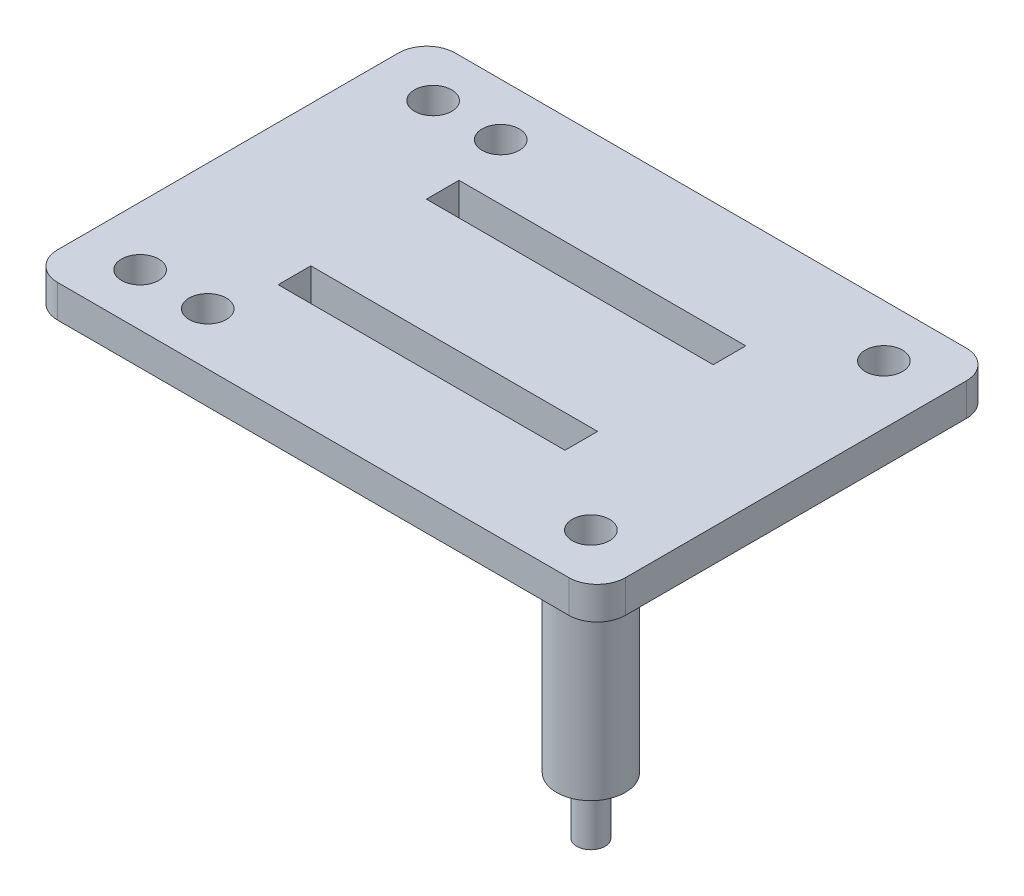
ISO-10303-21;
HEADER;
FILE_DESCRIPTION(('STEP AP214'),'2;1');
FILE_NAME('part.step','',(''),(''),'','','');
FILE_SCHEMA(('AUTOMOTIVE_DESIGN { 1 0 10303 214 1 1 1 1 }'));
ENDSEC;
DATA;
#1=APPLICATION_CONTEXT('core data for automotive mechanical design processes');
#2=APPLICATION_PROTOCOL_DEFINITION('international standard','automotive_design',2000,#1);
#3=PRODUCT_CONTEXT('',#1,'mechanical');
#4=PRODUCT('Part','Part','',(#3));
#5=PRODUCT_RELATED_PRODUCT_CATEGORY('part','',(#4));
#6=PRODUCT_DEFINITION_FORMATION('','',#4);
#7=PRODUCT_DEFINITION_CONTEXT('part definition',#1,'design');
#8=PRODUCT_DEFINITION('design','',#6,#7);
#9=PRODUCT_DEFINITION_SHAPE('','',#8);
#10=(LENGTH_UNIT() NAMED_UNIT(*) SI_UNIT(.MILLI.,.METRE.));
#11=(NAMED_UNIT(*) PLANE_ANGLE_UNIT() SI_UNIT($,.RADIAN.));
#12=(NAMED_UNIT(*) SI_UNIT($,.STERADIAN.) SOLID_ANGLE_UNIT());
#13=UNCERTAINTY_MEASURE_WITH_UNIT(LENGTH_MEASURE(1.E-05),#10,'distance_accuracy_value','');
#14=(GEOMETRIC_REPRESENTATION_CONTEXT(3) GLOBAL_UNCERTAINTY_ASSIGNED_CONTEXT((#13)) GLOBAL_UNIT_ASSIGNED_CONTEXT((#10,
#11,#12)) REPRESENTATION_CONTEXT('',''));
#15=CARTESIAN_POINT('',(0.,0.,0.));
#16=DIRECTION('',(0.,0.,1.));
#17=DIRECTION('',(1.,0.,0.));
#18=AXIS2_PLACEMENT_3D('',#15,#16,#17);
#19=CARTESIAN_POINT('',(40.,4.6,28.));
#20=DIRECTION('',(-1.,0.,0.));
#21=DIRECTION('',(0.,0.,1.));
#22=AXIS2_PLACEMENT_3D('',#19,#20,#21);
#23=PLANE('',#22);
#24=DIRECTION('',(0.,0.,-1.));
#25=VECTOR('',#24,1.);
#26=CARTESIAN_POINT('',(40.,0.,28.));
#27=LINE('',#26,#25);
#28=CARTESIAN_POINT('',(40.,0.,24.));
#29=VERTEX_POINT('',#28);
#30=CARTESIAN_POINT('',(40.,0.,-24.));
#31=VERTEX_POINT('',#30);
#32=EDGE_CURVE('E258',#29,#31,#27,.T.);
#33=ORIENTED_EDGE('',*,*,#32,.T.);
#34=DIRECTION('',(0.,-1.,0.));
#35=VECTOR('',#34,1.);
#36=CARTESIAN_POINT('',(40.,4.6,-24.));
#37=LINE('',#36,#35);
#38=CARTESIAN_POINT('',(40.,4.6,-24.));
#39=VERTEX_POINT('',#38);
#40=EDGE_CURVE('E308',#31,#39,#37,.F.);
#41=ORIENTED_EDGE('',*,*,#40,.T.);
#42=DIRECTION('',(0.,0.,-1.));
#43=VECTOR('',#42,1.);
#44=CARTESIAN_POINT('',(40.,4.6,28.));
#45=LINE('',#44,#43);
#46=CARTESIAN_POINT('',(40.,4.6,24.));
#47=VERTEX_POINT('',#46);
#48=EDGE_CURVE('E259',#47,#39,#45,.T.);
#49=ORIENTED_EDGE('',*,*,#48,.F.);
#50=DIRECTION('',(0.,-1.,0.));
#51=VECTOR('',#50,1.);
#52=CARTESIAN_POINT('',(40.,4.6,24.));
#53=LINE('',#52,#51);
#54=EDGE_CURVE('E305',#47,#29,#53,.T.);
#55=ORIENTED_EDGE('',*,*,#54,.T.);
#56=EDGE_LOOP('',(#33,#41,#49,#55));
#57=FACE_BOUND('',#56,.T.);
#58=ADVANCED_FACE('F44',(#57),#23,.F.);
#59=CARTESIAN_POINT('',(-40.,4.6,-28.));
#60=DIRECTION('',(0.,0.,1.));
#61=DIRECTION('',(1.,0.,0.));
#62=AXIS2_PLACEMENT_3D('',#59,#60,#61);
#63=PLANE('',#62);
#64=DIRECTION('',(-1.,0.,0.));
#65=VECTOR('',#64,1.);
#66=CARTESIAN_POINT('',(-40.,0.,-28.));
#67=LINE('',#66,#65);
#68=CARTESIAN_POINT('',(36.,0.,-28.));
#69=VERTEX_POINT('',#68);
#70=CARTESIAN_POINT('',(-36.,0.,-28.));
#71=VERTEX_POINT('',#70);
#72=EDGE_CURVE('E273',#69,#71,#67,.T.);
#73=ORIENTED_EDGE('',*,*,#72,.T.);
#74=DIRECTION('',(0.,-1.,0.));
#75=VECTOR('',#74,1.);
#76=CARTESIAN_POINT('',(-36.,4.6,-28.));
#77=LINE('',#76,#75);
#78=CARTESIAN_POINT('',(-36.,4.6,-28.));
#79=VERTEX_POINT('',#78);
#80=EDGE_CURVE('E296',#71,#79,#77,.F.);
#81=ORIENTED_EDGE('',*,*,#80,.T.);
#82=DIRECTION('',(-1.,0.,0.));
#83=VECTOR('',#82,1.);
#84=CARTESIAN_POINT('',(-40.,4.6,-28.));
#85=LINE('',#84,#83);
#86=CARTESIAN_POINT('',(36.,4.6,-28.));
#87=VERTEX_POINT('',#86);
#88=EDGE_CURVE('E262',#87,#79,#85,.T.);
#89=ORIENTED_EDGE('',*,*,#88,.F.);
#90=DIRECTION('',(0.,-1.,0.));
#91=VECTOR('',#90,1.);
#92=CARTESIAN_POINT('',(36.,4.6,-28.));
#93=LINE('',#92,#91);
#94=EDGE_CURVE('E293',#87,#69,#93,.T.);
#95=ORIENTED_EDGE('',*,*,#94,.T.);
#96=EDGE_LOOP('',(#73,#81,#89,#95));
#97=FACE_BOUND('',#96,.T.);
#98=ADVANCED_FACE('F332',(#97),#63,.F.);
#99=CARTESIAN_POINT('',(-40.,4.6,28.));
#100=DIRECTION('',(1.,0.,0.));
#101=DIRECTION('',(0.,0.,-1.));
#102=AXIS2_PLACEMENT_3D('',#99,#100,#101);
#103=PLANE('',#102);
#104=DIRECTION('',(0.,0.,1.));
#105=VECTOR('',#104,1.);
#106=CARTESIAN_POINT('',(-40.,4.6,28.));
#107=LINE('',#106,#105);
#108=CARTESIAN_POINT('',(-40.,4.6,-24.));
#109=VERTEX_POINT('',#108);
#110=CARTESIAN_POINT('',(-40.,4.6,24.));
#111=VERTEX_POINT('',#110);
#112=EDGE_CURVE('E266',#109,#111,#107,.T.);
#113=ORIENTED_EDGE('',*,*,#112,.F.);
#114=DIRECTION('',(0.,-1.,0.));
#115=VECTOR('',#114,1.);
#116=CARTESIAN_POINT('',(-40.,4.6,-24.));
#117=LINE('',#116,#115);
#118=CARTESIAN_POINT('',(-40.,0.,-24.));
#119=VERTEX_POINT('',#118);
#120=EDGE_CURVE('E282',#109,#119,#117,.T.);
#121=ORIENTED_EDGE('',*,*,#120,.T.);
#122=DIRECTION('',(0.,0.,1.));
#123=VECTOR('',#122,1.);
#124=CARTESIAN_POINT('',(-40.,0.,28.));
#125=LINE('',#124,#123);
#126=CARTESIAN_POINT('',(-40.,0.,24.));
#127=VERTEX_POINT('',#126);
#128=EDGE_CURVE('E276',#119,#127,#125,.T.);
#129=ORIENTED_EDGE('',*,*,#128,.T.);
#130=DIRECTION('',(0.,-1.,0.));
#131=VECTOR('',#130,1.);
#132=CARTESIAN_POINT('',(-40.,4.6,24.));
#133=LINE('',#132,#131);
#134=EDGE_CURVE('E280',#127,#111,#133,.F.);
#135=ORIENTED_EDGE('',*,*,#134,.T.);
#136=EDGE_LOOP('',(#113,#121,#129,#135));
#137=FACE_BOUND('',#136,.T.);
#138=ADVANCED_FACE('F340',(#137),#103,.F.);
#139=CARTESIAN_POINT('',(-40.,4.6,28.));
#140=DIRECTION('',(0.,0.,-1.));
#141=DIRECTION('',(-1.,0.,0.));
#142=AXIS2_PLACEMENT_3D('',#139,#140,#141);
#143=PLANE('',#142);
#144=DIRECTION('',(1.,0.,0.));
#145=VECTOR('',#144,1.);
#146=CARTESIAN_POINT('',(-40.,0.,28.));
#147=LINE('',#146,#145);
#148=CARTESIAN_POINT('',(-36.,0.,28.));
#149=VERTEX_POINT('',#148);
#150=CARTESIAN_POINT('',(36.,0.,28.));
#151=VERTEX_POINT('',#150);
#152=EDGE_CURVE('E263',#149,#151,#147,.T.);
#153=ORIENTED_EDGE('',*,*,#152,.T.);
#154=DIRECTION('',(0.,-1.,0.));
#155=VECTOR('',#154,1.);
#156=CARTESIAN_POINT('',(36.,4.6,28.));
#157=LINE('',#156,#155);
#158=CARTESIAN_POINT('',(36.,4.6,28.));
#159=VERTEX_POINT('',#158);
#160=EDGE_CURVE('E11',#151,#159,#157,.F.);
#161=ORIENTED_EDGE('',*,*,#160,.T.);
#162=DIRECTION('',(1.,0.,0.));
#163=VECTOR('',#162,1.);
#164=CARTESIAN_POINT('',(-40.,4.6,28.));
#165=LINE('',#164,#163);
#166=CARTESIAN_POINT('',(-36.,4.6,28.));
#167=VERTEX_POINT('',#166);
#168=EDGE_CURVE('E268',#167,#159,#165,.T.);
#169=ORIENTED_EDGE('',*,*,#168,.F.);
#170=DIRECTION('',(0.,-1.,0.));
#171=VECTOR('',#170,1.);
#172=CARTESIAN_POINT('',(-36.,4.6,28.));
#173=LINE('',#172,#171);
#174=EDGE_CURVE('E52',#167,#149,#173,.T.);
#175=ORIENTED_EDGE('',*,*,#174,.T.);
#176=EDGE_LOOP('',(#153,#161,#169,#175));
#177=FACE_BOUND('',#176,.T.);
#178=ADVANCED_FACE('F312',(#177),#143,.F.);
#179=CARTESIAN_POINT('',(0.,4.6,0.));
#180=DIRECTION('',(0.,-1.,0.));
#181=DIRECTION('',(0.,0.,-1.));
#182=AXIS2_PLACEMENT_3D('',#179,#180,#181);
#183=PLANE('',#182);
#184=DIRECTION('',(-1.,0.,0.));
#185=VECTOR('',#184,1.);
#186=CARTESIAN_POINT('',(-20.2,4.6,-8.13750000000002));
#187=LINE('',#186,#185);
#188=CARTESIAN_POINT('',(20.2,4.6,-8.13750000000002));
#189=VERTEX_POINT('',#188);
#190=CARTESIAN_POINT('',(-20.2,4.6,-8.13750000000002));
#191=VERTEX_POINT('',#190);
#192=EDGE_CURVE('E208',#189,#191,#187,.T.);
#193=ORIENTED_EDGE('',*,*,#192,.T.);
#194=DIRECTION('',(0.,0.,-1.));
#195=VECTOR('',#194,1.);
#196=CARTESIAN_POINT('',(-20.2,4.6,-12.7375));
#197=LINE('',#196,#195);
#198=CARTESIAN_POINT('',(-20.2,4.6,-12.7375));
#199=VERTEX_POINT('',#198);
#200=EDGE_CURVE('E212',#191,#199,#197,.T.);
#201=ORIENTED_EDGE('',*,*,#200,.T.);
#202=DIRECTION('',(1.,0.,0.));
#203=VECTOR('',#202,1.);
#204=CARTESIAN_POINT('',(-20.2,4.6,-12.7375));
#205=LINE('',#204,#203);
#206=CARTESIAN_POINT('',(20.2,4.6,-12.7375));
#207=VERTEX_POINT('',#206);
#208=EDGE_CURVE('E235',#199,#207,#205,.T.);
#209=ORIENTED_EDGE('',*,*,#208,.T.);
#210=DIRECTION('',(0.,0.,1.));
#211=VECTOR('',#210,1.);
#212=CARTESIAN_POINT('',(20.2,4.6,-12.7375));
#213=LINE('',#212,#211);
#214=EDGE_CURVE('E232',#207,#189,#213,.T.);
#215=ORIENTED_EDGE('',*,*,#214,.T.);
#216=EDGE_LOOP('',(#193,#201,#209,#215));
#217=FACE_BOUND('',#216,.T.);
#218=CARTESIAN_POINT('',(-31.75,4.6,20.6375));
#219=DIRECTION('',(0.,-1.,0.));
#220=DIRECTION('',(0.,0.,-1.));
#221=AXIS2_PLACEMENT_3D('',#218,#219,#220);
#222=CIRCLE('',#221,2.625);
#223=CARTESIAN_POINT('',(-31.75,4.6,18.0125));
#224=VERTEX_POINT('',#223);
#225=EDGE_CURVE('E200',#224,#224,#222,.T.);
#226=ORIENTED_EDGE('',*,*,#225,.T.);
#227=EDGE_LOOP('',(#226));
#228=FACE_BOUND('',#227,.T.);
#229=CARTESIAN_POINT('',(31.75,4.6,20.6375));
#230=DIRECTION('',(0.,-1.,0.));
#231=DIRECTION('',(0.,0.,-1.));
#232=AXIS2_PLACEMENT_3D('',#229,#230,#231);
#233=CIRCLE('',#232,2.625);
#234=CARTESIAN_POINT('',(31.75,4.6,18.0125));
#235=VERTEX_POINT('',#234);
#236=EDGE_CURVE('E207',#235,#235,#233,.T.);
#237=ORIENTED_EDGE('',*,*,#236,.T.);
#238=EDGE_LOOP('',(#237));
#239=FACE_BOUND('',#238,.T.);
#240=CARTESIAN_POINT('',(-31.75,4.6,-20.6375));
#241=DIRECTION('',(0.,-1.,0.));
#242=DIRECTION('',(0.,0.,-1.));
#243=AXIS2_PLACEMENT_3D('',#240,#241,#242);
#244=CIRCLE('',#243,2.625);
#245=CARTESIAN_POINT('',(-31.75,4.6,-23.2625));
#246=VERTEX_POINT('',#245);
#247=EDGE_CURVE('E241',#246,#246,#244,.T.);
#248=ORIENTED_EDGE('',*,*,#247,.T.);
#249=EDGE_LOOP('',(#248));
#250=FACE_BOUND('',#249,.T.);
#251=DIRECTION('',(1.,0.,0.));
#252=VECTOR('',#251,1.);
#253=CARTESIAN_POINT('',(-20.2,4.6,8.13750000000002));
#254=LINE('',#253,#252);
#255=CARTESIAN_POINT('',(-20.2,4.6,8.13750000000002));
#256=VERTEX_POINT('',#255);
#257=CARTESIAN_POINT('',(20.2,4.6,8.13750000000002));
#258=VERTEX_POINT('',#257);
#259=EDGE_CURVE('E182',#256,#258,#254,.T.);
#260=ORIENTED_EDGE('',*,*,#259,.T.);
#261=DIRECTION('',(0.,0.,1.));
#262=VECTOR('',#261,1.);
#263=CARTESIAN_POINT('',(20.2,4.6,12.7375));
#264=LINE('',#263,#262);
#265=CARTESIAN_POINT('',(20.2,4.6,12.7375));
#266=VERTEX_POINT('',#265);
#267=EDGE_CURVE('E167',#258,#266,#264,.T.);
#268=ORIENTED_EDGE('',*,*,#267,.T.);
#269=DIRECTION('',(-1.,0.,0.));
#270=VECTOR('',#269,1.);
#271=CARTESIAN_POINT('',(-20.2,4.6,12.7375));
#272=LINE('',#271,#270);
#273=CARTESIAN_POINT('',(-20.2,4.6,12.7375));
#274=VERTEX_POINT('',#273);
#275=EDGE_CURVE('E157',#266,#274,#272,.T.);
#276=ORIENTED_EDGE('',*,*,#275,.T.);
#277=DIRECTION('',(0.,0.,-1.));
#278=VECTOR('',#277,1.);
#279=CARTESIAN_POINT('',(-20.2,4.6,12.7375));
#280=LINE('',#279,#278);
#281=EDGE_CURVE('E168',#274,#256,#280,.T.);
#282=ORIENTED_EDGE('',*,*,#281,.T.);
#283=EDGE_LOOP('',(#260,#268,#276,#282));
#284=FACE_BOUND('',#283,.T.);
#285=CARTESIAN_POINT('',(-22.225,4.6,-20.6375));
#286=DIRECTION('',(0.,-1.,0.));
#287=DIRECTION('',(0.,0.,-1.));
#288=AXIS2_PLACEMENT_3D('',#285,#286,#287);
#289=CIRCLE('',#288,2.625);
#290=CARTESIAN_POINT('',(-22.225,4.6,-23.2625));
#291=VERTEX_POINT('',#290);
#292=EDGE_CURVE('E187',#291,#291,#289,.T.);
#293=ORIENTED_EDGE('',*,*,#292,.T.);
#294=EDGE_LOOP('',(#293));
#295=FACE_BOUND('',#294,.T.);
#296=CARTESIAN_POINT('',(-22.225,4.6,20.6375));
#297=DIRECTION('',(0.,-1.,0.));
#298=DIRECTION('',(0.,0.,-1.));
#299=AXIS2_PLACEMENT_3D('',#296,#297,#298);
#300=CIRCLE('',#299,2.625);
#301=CARTESIAN_POINT('',(-22.225,4.6,18.0125));
#302=VERTEX_POINT('',#301);
#303=EDGE_CURVE('E194',#302,#302,#300,.T.);
#304=ORIENTED_EDGE('',*,*,#303,.T.);
#305=EDGE_LOOP('',(#304));
#306=FACE_BOUND('',#305,.T.);
#307=CARTESIAN_POINT('',(31.75,4.6,-20.6375));
#308=DIRECTION('',(0.,-1.,0.));
#309=DIRECTION('',(0.,0.,-1.));
#310=AXIS2_PLACEMENT_3D('',#307,#308,#309);
#311=CIRCLE('',#310,2.625);
#312=CARTESIAN_POINT('',(31.75,4.6,-23.2625));
#313=VERTEX_POINT('',#312);
#314=EDGE_CURVE('E255',#313,#313,#311,.T.);
#315=ORIENTED_EDGE('',*,*,#314,.T.);
#316=EDGE_LOOP('',(#315));
#317=FACE_BOUND('',#316,.T.);
#318=ORIENTED_EDGE('',*,*,#88,.T.);
#319=CARTESIAN_POINT('',(-36.,4.6,-24.));
#320=DIRECTION('',(0.,-1.,0.));
#321=DIRECTION('',(0.,0.,-1.));
#322=AXIS2_PLACEMENT_3D('',#319,#320,#321);
#323=CIRCLE('',#322,4.);
#324=EDGE_CURVE('E303',#79,#109,#323,.F.);
#325=ORIENTED_EDGE('',*,*,#324,.T.);
#326=ORIENTED_EDGE('',*,*,#112,.T.);
#327=CARTESIAN_POINT('',(-36.,4.6,24.));
#328=DIRECTION('',(0.,-1.,0.));
#329=DIRECTION('',(0.,0.,-1.));
#330=AXIS2_PLACEMENT_3D('',#327,#328,#329);
#331=CIRCLE('',#330,4.);
#332=EDGE_CURVE('E64',#111,#167,#331,.F.);
#333=ORIENTED_EDGE('',*,*,#332,.T.);
#334=ORIENTED_EDGE('',*,*,#168,.T.);
#335=CARTESIAN_POINT('',(36.,4.6,24.));
#336=DIRECTION('',(0.,-1.,0.));
#337=DIRECTION('',(0.,0.,-1.));
#338=AXIS2_PLACEMENT_3D('',#335,#336,#337);
#339=CIRCLE('',#338,4.);
#340=EDGE_CURVE('E299',#159,#47,#339,.F.);
#341=ORIENTED_EDGE('',*,*,#340,.T.);
#342=ORIENTED_EDGE('',*,*,#48,.T.);
#343=CARTESIAN_POINT('',(36.,4.6,-24.));
#344=DIRECTION('',(0.,-1.,0.));
#345=DIRECTION('',(0.,0.,-1.));
#346=AXIS2_PLACEMENT_3D('',#343,#344,#345);
#347=CIRCLE('',#346,4.);
#348=EDGE_CURVE('E301',#39,#87,#347,.F.);
#349=ORIENTED_EDGE('',*,*,#348,.T.);
#350=EDGE_LOOP('',(#318,#325,#326,#333,#334,#341,#342,#349));
#351=FACE_BOUND('',#350,.T.);
#352=ADVANCED_FACE('F179',(#217,#228,#239,#250,#284,#295,#306,#317,#351),#183,.F.);
#353=CARTESIAN_POINT('',(0.,0.,0.));
#354=DIRECTION('',(0.,-1.,0.));
#355=DIRECTION('',(0.,0.,-1.));
#356=AXIS2_PLACEMENT_3D('',#353,#354,#355);
#357=PLANE('',#356);
#358=CARTESIAN_POINT('',(31.75,0.,20.6375));
#359=DIRECTION('',(0.,-1.,0.));
#360=DIRECTION('',(0.,0.,-1.));
#361=AXIS2_PLACEMENT_3D('',#358,#359,#360);
#362=CIRCLE('',#361,4.85);
#363=CARTESIAN_POINT('',(31.75,0.,15.7875));
#364=VERTEX_POINT('',#363);
#365=EDGE_CURVE('E624',#364,#364,#362,.T.);
#366=ORIENTED_EDGE('',*,*,#365,.F.);
#367=EDGE_LOOP('',(#366));
#368=FACE_BOUND('',#367,.T.);
#369=DIRECTION('',(0.,0.,1.));
#370=VECTOR('',#369,1.);
#371=CARTESIAN_POINT('',(-20.2,0.,-12.7375));
#372=LINE('',#371,#370);
#373=CARTESIAN_POINT('',(-20.2,0.,-12.7375));
#374=VERTEX_POINT('',#373);
#375=CARTESIAN_POINT('',(-20.2,0.,-8.13750000000002));
#376=VERTEX_POINT('',#375);
#377=EDGE_CURVE('E224',#374,#376,#372,.T.);
#378=ORIENTED_EDGE('',*,*,#377,.T.);
#379=DIRECTION('',(1.,0.,0.));
#380=VECTOR('',#379,1.);
#381=CARTESIAN_POINT('',(-20.2,0.,-8.13750000000002));
#382=LINE('',#381,#380);
#383=CARTESIAN_POINT('',(20.2,0.,-8.13750000000002));
#384=VERTEX_POINT('',#383);
#385=EDGE_CURVE('E221',#376,#384,#382,.T.);
#386=ORIENTED_EDGE('',*,*,#385,.T.);
#387=DIRECTION('',(0.,0.,-1.));
#388=VECTOR('',#387,1.);
#389=CARTESIAN_POINT('',(20.2,0.,-12.7375));
#390=LINE('',#389,#388);
#391=CARTESIAN_POINT('',(20.2,0.,-12.7375));
#392=VERTEX_POINT('',#391);
#393=EDGE_CURVE('E204',#384,#392,#390,.T.);
#394=ORIENTED_EDGE('',*,*,#393,.T.);
#395=DIRECTION('',(-1.,0.,0.));
#396=VECTOR('',#395,1.);
#397=CARTESIAN_POINT('',(-20.2,0.,-12.7375));
#398=LINE('',#397,#396);
#399=EDGE_CURVE('E227',#392,#374,#398,.T.);
#400=ORIENTED_EDGE('',*,*,#399,.T.);
#401=EDGE_LOOP('',(#378,#386,#394,#400));
#402=FACE_BOUND('',#401,.T.);
#403=CARTESIAN_POINT('',(-31.75,0.,20.6375));
#404=DIRECTION('',(0.,1.,0.));
#405=DIRECTION('',(0.,0.,-1.));
#406=AXIS2_PLACEMENT_3D('',#403,#404,#405);
#407=CIRCLE('',#406,2.625);
#408=CARTESIAN_POINT('',(-31.75,0.,18.0125));
#409=VERTEX_POINT('',#408);
#410=EDGE_CURVE('E203',#409,#409,#407,.T.);
#411=ORIENTED_EDGE('',*,*,#410,.T.);
#412=EDGE_LOOP('',(#411));
#413=FACE_BOUND('',#412,.T.);
#414=CARTESIAN_POINT('',(-31.75,0.,-20.6375));
#415=DIRECTION('',(0.,1.,0.));
#416=DIRECTION('',(0.,0.,1.));
#417=AXIS2_PLACEMENT_3D('',#414,#415,#416);
#418=CIRCLE('',#417,2.625);
#419=CARTESIAN_POINT('',(-31.75,0.,-18.0125));
#420=VERTEX_POINT('',#419);
#421=EDGE_CURVE('E244',#420,#420,#418,.T.);
#422=ORIENTED_EDGE('',*,*,#421,.T.);
#423=EDGE_LOOP('',(#422));
#424=FACE_BOUND('',#423,.T.);
#425=DIRECTION('',(0.,0.,-1.));
#426=VECTOR('',#425,1.);
#427=CARTESIAN_POINT('',(20.2,0.,12.7375));
#428=LINE('',#427,#426);
#429=CARTESIAN_POINT('',(20.2,0.,12.7375));
#430=VERTEX_POINT('',#429);
#431=CARTESIAN_POINT('',(20.2,0.,8.13750000000002));
#432=VERTEX_POINT('',#431);
#433=EDGE_CURVE('E174',#430,#432,#428,.T.);
#434=ORIENTED_EDGE('',*,*,#433,.T.);
#435=DIRECTION('',(-1.,0.,0.));
#436=VECTOR('',#435,1.);
#437=CARTESIAN_POINT('',(-20.2,0.,8.13750000000002));
#438=LINE('',#437,#436);
#439=CARTESIAN_POINT('',(-20.2,0.,8.13750000000002));
#440=VERTEX_POINT('',#439);
#441=EDGE_CURVE('E612',#432,#440,#438,.T.);
#442=ORIENTED_EDGE('',*,*,#441,.T.);
#443=DIRECTION('',(0.,0.,1.));
#444=VECTOR('',#443,1.);
#445=CARTESIAN_POINT('',(-20.2,0.,12.7375));
#446=LINE('',#445,#444);
#447=CARTESIAN_POINT('',(-20.2,0.,12.7375));
#448=VERTEX_POINT('',#447);
#449=EDGE_CURVE('E236',#440,#448,#446,.T.);
#450=ORIENTED_EDGE('',*,*,#449,.T.);
#451=DIRECTION('',(1.,0.,0.));
#452=VECTOR('',#451,1.);
#453=CARTESIAN_POINT('',(-20.2,0.,12.7375));
#454=LINE('',#453,#452);
#455=EDGE_CURVE('E613',#448,#430,#454,.T.);
#456=ORIENTED_EDGE('',*,*,#455,.T.);
#457=EDGE_LOOP('',(#434,#442,#450,#456));
#458=FACE_BOUND('',#457,.T.);
#459=CARTESIAN_POINT('',(-22.225,0.,-20.6375));
#460=DIRECTION('',(0.,1.,0.));
#461=DIRECTION('',(0.,0.,1.));
#462=AXIS2_PLACEMENT_3D('',#459,#460,#461);
#463=CIRCLE('',#462,2.625);
#464=CARTESIAN_POINT('',(-22.225,0.,-18.0125));
#465=VERTEX_POINT('',#464);
#466=EDGE_CURVE('E190',#465,#465,#463,.T.);
#467=ORIENTED_EDGE('',*,*,#466,.T.);
#468=EDGE_LOOP('',(#467));
#469=FACE_BOUND('',#468,.T.);
#470=CARTESIAN_POINT('',(-22.225,0.,20.6375));
#471=DIRECTION('',(0.,1.,0.));
#472=DIRECTION('',(0.,0.,-1.));
#473=AXIS2_PLACEMENT_3D('',#470,#471,#472);
#474=CIRCLE('',#473,2.625);
#475=CARTESIAN_POINT('',(-22.225,0.,18.0125));
#476=VERTEX_POINT('',#475);
#477=EDGE_CURVE('E191',#476,#476,#474,.T.);
#478=ORIENTED_EDGE('',*,*,#477,.T.);
#479=EDGE_LOOP('',(#478));
#480=FACE_BOUND('',#479,.T.);
#481=CARTESIAN_POINT('',(31.75,0.,-20.6375));
#482=DIRECTION('',(0.,1.,0.));
#483=DIRECTION('',(0.,0.,-1.));
#484=AXIS2_PLACEMENT_3D('',#481,#482,#483);
#485=CIRCLE('',#484,2.625);
#486=CARTESIAN_POINT('',(31.75,0.,-23.2625));
#487=VERTEX_POINT('',#486);
#488=EDGE_CURVE('E248',#487,#487,#485,.T.);
#489=ORIENTED_EDGE('',*,*,#488,.T.);
#490=EDGE_LOOP('',(#489));
#491=FACE_BOUND('',#490,.T.);
#492=ORIENTED_EDGE('',*,*,#128,.F.);
#493=CARTESIAN_POINT('',(-36.,0.,-24.));
#494=DIRECTION('',(0.,-1.,0.));
#495=DIRECTION('',(0.,0.,-1.));
#496=AXIS2_PLACEMENT_3D('',#493,#494,#495);
#497=CIRCLE('',#496,4.);
#498=EDGE_CURVE('E291',#119,#71,#497,.T.);
#499=ORIENTED_EDGE('',*,*,#498,.T.);
#500=ORIENTED_EDGE('',*,*,#72,.F.);
#501=CARTESIAN_POINT('',(36.,0.,-24.));
#502=DIRECTION('',(0.,-1.,0.));
#503=DIRECTION('',(0.,0.,-1.));
#504=AXIS2_PLACEMENT_3D('',#501,#502,#503);
#505=CIRCLE('',#504,4.);
#506=EDGE_CURVE('E289',#69,#31,#505,.T.);
#507=ORIENTED_EDGE('',*,*,#506,.T.);
#508=ORIENTED_EDGE('',*,*,#32,.F.);
#509=CARTESIAN_POINT('',(36.,0.,24.));
#510=DIRECTION('',(0.,-1.,0.));
#511=DIRECTION('',(0.,0.,-1.));
#512=AXIS2_PLACEMENT_3D('',#509,#510,#511);
#513=CIRCLE('',#512,4.);
#514=EDGE_CURVE('E287',#29,#151,#513,.T.);
#515=ORIENTED_EDGE('',*,*,#514,.T.);
#516=ORIENTED_EDGE('',*,*,#152,.F.);
#517=CARTESIAN_POINT('',(-36.,0.,24.));
#518=DIRECTION('',(0.,-1.,0.));
#519=DIRECTION('',(0.,0.,-1.));
#520=AXIS2_PLACEMENT_3D('',#517,#518,#519);
#521=CIRCLE('',#520,4.);
#522=EDGE_CURVE('E285',#149,#127,#521,.T.);
#523=ORIENTED_EDGE('',*,*,#522,.T.);
#524=EDGE_LOOP('',(#492,#499,#500,#507,#508,#515,#516,#523));
#525=FACE_BOUND('',#524,.T.);
#526=ADVANCED_FACE('F316',(#368,#402,#413,#424,#458,#469,#480,#491,#525),#357,.T.);
#527=CARTESIAN_POINT('',(31.75,45.2610378618156,-20.6375));
#528=DIRECTION('',(0.,-1.,0.));
#529=DIRECTION('',(0.,0.,-1.));
#530=AXIS2_PLACEMENT_3D('',#527,#528,#529);
#531=CYLINDRICAL_SURFACE('',#530,2.625);
#532=ORIENTED_EDGE('',*,*,#314,.F.);
#533=EDGE_LOOP('',(#532));
#534=FACE_BOUND('',#533,.T.);
#535=ORIENTED_EDGE('',*,*,#488,.F.);
#536=EDGE_LOOP('',(#535));
#537=FACE_BOUND('',#536,.T.);
#538=ADVANCED_FACE('F535',(#534,#537),#531,.F.);
#539=CARTESIAN_POINT('',(-22.225,45.2610378618156,20.6375));
#540=DIRECTION('',(0.,-1.,0.));
#541=DIRECTION('',(0.,0.,-1.));
#542=AXIS2_PLACEMENT_3D('',#539,#540,#541);
#543=CYLINDRICAL_SURFACE('',#542,2.625);
#544=ORIENTED_EDGE('',*,*,#303,.F.);
#545=EDGE_LOOP('',(#544));
#546=FACE_BOUND('',#545,.T.);
#547=ORIENTED_EDGE('',*,*,#477,.F.);
#548=EDGE_LOOP('',(#547));
#549=FACE_BOUND('',#548,.T.);
#550=ADVANCED_FACE('F526',(#546,#549),#543,.F.);
#551=CARTESIAN_POINT('',(-22.225,45.2610378618156,-20.6375));
#552=DIRECTION('',(0.,-1.,0.));
#553=DIRECTION('',(0.,0.,-1.));
#554=AXIS2_PLACEMENT_3D('',#551,#552,#553);
#555=CYLINDRICAL_SURFACE('',#554,2.625);
#556=ORIENTED_EDGE('',*,*,#292,.F.);
#557=EDGE_LOOP('',(#556));
#558=FACE_BOUND('',#557,.T.);
#559=ORIENTED_EDGE('',*,*,#466,.F.);
#560=EDGE_LOOP('',(#559));
#561=FACE_BOUND('',#560,.T.);
#562=ADVANCED_FACE('F517',(#558,#561),#555,.F.);
#563=CARTESIAN_POINT('',(-20.2,45.2610378618156,8.13750000000002));
#564=DIRECTION('',(0.,0.,1.));
#565=DIRECTION('',(1.,0.,0.));
#566=AXIS2_PLACEMENT_3D('',#563,#564,#565);
#567=PLANE('',#566);
#568=DIRECTION('',(0.,-1.,0.));
#569=VECTOR('',#568,1.);
#570=CARTESIAN_POINT('',(-20.2,45.2610378618156,8.13750000000002));
#571=LINE('',#570,#569);
#572=EDGE_CURVE('E616',#256,#440,#571,.T.);
#573=ORIENTED_EDGE('',*,*,#572,.T.);
#574=ORIENTED_EDGE('',*,*,#441,.F.);
#575=DIRECTION('',(0.,-1.,0.));
#576=VECTOR('',#575,1.);
#577=CARTESIAN_POINT('',(20.2,45.2610378618156,8.13750000000002));
#578=LINE('',#577,#576);
#579=EDGE_CURVE('E176',#258,#432,#578,.T.);
#580=ORIENTED_EDGE('',*,*,#579,.F.);
#581=ORIENTED_EDGE('',*,*,#259,.F.);
#582=EDGE_LOOP('',(#573,#574,#580,#581));
#583=FACE_BOUND('',#582,.T.);
#584=ADVANCED_FACE('F509',(#583),#567,.T.);
#585=CARTESIAN_POINT('',(20.2,45.2610378618156,12.7375));
#586=DIRECTION('',(-1.,0.,0.));
#587=DIRECTION('',(0.,0.,1.));
#588=AXIS2_PLACEMENT_3D('',#585,#586,#587);
#589=PLANE('',#588);
#590=ORIENTED_EDGE('',*,*,#579,.T.);
#591=ORIENTED_EDGE('',*,*,#433,.F.);
#592=DIRECTION('',(0.,-1.,0.));
#593=VECTOR('',#592,1.);
#594=CARTESIAN_POINT('',(20.2,45.2610378618156,12.7375));
#595=LINE('',#594,#593);
#596=EDGE_CURVE('E160',#266,#430,#595,.T.);
#597=ORIENTED_EDGE('',*,*,#596,.F.);
#598=ORIENTED_EDGE('',*,*,#267,.F.);
#599=EDGE_LOOP('',(#590,#591,#597,#598));
#600=FACE_BOUND('',#599,.T.);
#601=ADVANCED_FACE('F171',(#600),#589,.T.);
#602=CARTESIAN_POINT('',(-20.2,45.2610378618156,12.7375));
#603=DIRECTION('',(0.,0.,-1.));
#604=DIRECTION('',(-1.,0.,0.));
#605=AXIS2_PLACEMENT_3D('',#602,#603,#604);
#606=PLANE('',#605);
#607=ORIENTED_EDGE('',*,*,#596,.T.);
#608=ORIENTED_EDGE('',*,*,#455,.F.);
#609=DIRECTION('',(0.,-1.,0.));
#610=VECTOR('',#609,1.);
#611=CARTESIAN_POINT('',(-20.2,45.2610378618156,12.7375));
#612=LINE('',#611,#610);
#613=EDGE_CURVE('E163',#274,#448,#612,.T.);
#614=ORIENTED_EDGE('',*,*,#613,.F.);
#615=ORIENTED_EDGE('',*,*,#275,.F.);
#616=EDGE_LOOP('',(#607,#608,#614,#615));
#617=FACE_BOUND('',#616,.T.);
#618=ADVANCED_FACE('F159',(#617),#606,.T.);
#619=CARTESIAN_POINT('',(-20.2,45.2610378618156,12.7375));
#620=DIRECTION('',(1.,0.,0.));
#621=DIRECTION('',(0.,0.,-1.));
#622=AXIS2_PLACEMENT_3D('',#619,#620,#621);
#623=PLANE('',#622);
#624=ORIENTED_EDGE('',*,*,#613,.T.);
#625=ORIENTED_EDGE('',*,*,#449,.F.);
#626=ORIENTED_EDGE('',*,*,#572,.F.);
#627=ORIENTED_EDGE('',*,*,#281,.F.);
#628=EDGE_LOOP('',(#624,#625,#626,#627));
#629=FACE_BOUND('',#628,.T.);
#630=ADVANCED_FACE('F485',(#629),#623,.T.);
#631=CARTESIAN_POINT('',(-31.75,45.2610378618156,-20.6375));
#632=DIRECTION('',(0.,-1.,0.));
#633=DIRECTION('',(0.,0.,-1.));
#634=AXIS2_PLACEMENT_3D('',#631,#632,#633);
#635=CYLINDRICAL_SURFACE('',#634,2.625);
#636=ORIENTED_EDGE('',*,*,#247,.F.);
#637=EDGE_LOOP('',(#636));
#638=FACE_BOUND('',#637,.T.);
#639=ORIENTED_EDGE('',*,*,#421,.F.);
#640=EDGE_LOOP('',(#639));
#641=FACE_BOUND('',#640,.T.);
#642=ADVANCED_FACE('F476',(#638,#641),#635,.F.);
#643=CARTESIAN_POINT('',(31.75,45.2610378618156,20.6375));
#644=DIRECTION('',(0.,-1.,0.));
#645=DIRECTION('',(0.,0.,-1.));
#646=AXIS2_PLACEMENT_3D('',#643,#644,#645);
#647=CYLINDRICAL_SURFACE('',#646,2.625);
#648=ORIENTED_EDGE('',*,*,#236,.F.);
#649=EDGE_LOOP('',(#648));
#650=FACE_BOUND('',#649,.T.);
#651=CARTESIAN_POINT('',(31.75,0.,20.6375));
#652=DIRECTION('',(0.,1.,0.));
#653=DIRECTION('',(0.,0.,1.));
#654=AXIS2_PLACEMENT_3D('',#651,#652,#653);
#655=CIRCLE('',#654,2.625);
#656=CARTESIAN_POINT('',(31.75,0.,23.2625));
#657=VERTEX_POINT('',#656);
#658=EDGE_CURVE('E245',#657,#657,#655,.T.);
#659=ORIENTED_EDGE('',*,*,#658,.F.);
#660=EDGE_LOOP('',(#659));
#661=FACE_BOUND('',#660,.T.);
#662=ADVANCED_FACE('F467',(#650,#661),#647,.F.);
#663=CARTESIAN_POINT('',(-31.75,45.2610378618156,20.6375));
#664=DIRECTION('',(0.,-1.,0.));
#665=DIRECTION('',(0.,0.,-1.));
#666=AXIS2_PLACEMENT_3D('',#663,#664,#665);
#667=CYLINDRICAL_SURFACE('',#666,2.625);
#668=ORIENTED_EDGE('',*,*,#225,.F.);
#669=EDGE_LOOP('',(#668));
#670=FACE_BOUND('',#669,.T.);
#671=ORIENTED_EDGE('',*,*,#410,.F.);
#672=EDGE_LOOP('',(#671));
#673=FACE_BOUND('',#672,.T.);
#674=ADVANCED_FACE('F458',(#670,#673),#667,.F.);
#675=CARTESIAN_POINT('',(-20.2,45.2610378618156,-8.13750000000002));
#676=DIRECTION('',(0.,0.,-1.));
#677=DIRECTION('',(-1.,0.,0.));
#678=AXIS2_PLACEMENT_3D('',#675,#676,#677);
#679=PLANE('',#678);
#680=DIRECTION('',(0.,-1.,0.));
#681=VECTOR('',#680,1.);
#682=CARTESIAN_POINT('',(20.2,45.2610378618156,-8.13750000000002));
#683=LINE('',#682,#681);
#684=EDGE_CURVE('E219',#189,#384,#683,.T.);
#685=ORIENTED_EDGE('',*,*,#684,.T.);
#686=ORIENTED_EDGE('',*,*,#385,.F.);
#687=DIRECTION('',(0.,-1.,0.));
#688=VECTOR('',#687,1.);
#689=CARTESIAN_POINT('',(-20.2,45.2610378618156,-8.13750000000002));
#690=LINE('',#689,#688);
#691=EDGE_CURVE('E217',#191,#376,#690,.T.);
#692=ORIENTED_EDGE('',*,*,#691,.F.);
#693=ORIENTED_EDGE('',*,*,#192,.F.);
#694=EDGE_LOOP('',(#685,#686,#692,#693));
#695=FACE_BOUND('',#694,.T.);
#696=ADVANCED_FACE('F449',(#695),#679,.T.);
#697=CARTESIAN_POINT('',(-20.2,45.2610378618156,-12.7375));
#698=DIRECTION('',(1.,0.,0.));
#699=DIRECTION('',(0.,0.,-1.));
#700=AXIS2_PLACEMENT_3D('',#697,#698,#699);
#701=PLANE('',#700);
#702=ORIENTED_EDGE('',*,*,#691,.T.);
#703=ORIENTED_EDGE('',*,*,#377,.F.);
#704=DIRECTION('',(0.,-1.,0.));
#705=VECTOR('',#704,1.);
#706=CARTESIAN_POINT('',(-20.2,45.2610378618156,-12.7375));
#707=LINE('',#706,#705);
#708=EDGE_CURVE('E215',#199,#374,#707,.T.);
#709=ORIENTED_EDGE('',*,*,#708,.F.);
#710=ORIENTED_EDGE('',*,*,#200,.F.);
#711=EDGE_LOOP('',(#702,#703,#709,#710));
#712=FACE_BOUND('',#711,.T.);
#713=ADVANCED_FACE('F440',(#712),#701,.T.);
#714=CARTESIAN_POINT('',(-20.2,45.2610378618156,-12.7375));
#715=DIRECTION('',(0.,0.,1.));
#716=DIRECTION('',(1.,0.,0.));
#717=AXIS2_PLACEMENT_3D('',#714,#715,#716);
#718=PLANE('',#717);
#719=ORIENTED_EDGE('',*,*,#708,.T.);
#720=ORIENTED_EDGE('',*,*,#399,.F.);
#721=DIRECTION('',(0.,-1.,0.));
#722=VECTOR('',#721,1.);
#723=CARTESIAN_POINT('',(20.2,45.2610378618156,-12.7375));
#724=LINE('',#723,#722);
#725=EDGE_CURVE('E211',#207,#392,#724,.T.);
#726=ORIENTED_EDGE('',*,*,#725,.F.);
#727=ORIENTED_EDGE('',*,*,#208,.F.);
#728=EDGE_LOOP('',(#719,#720,#726,#727));
#729=FACE_BOUND('',#728,.T.);
#730=ADVANCED_FACE('F431',(#729),#718,.T.);
#731=CARTESIAN_POINT('',(20.2,45.2610378618156,-12.7375));
#732=DIRECTION('',(-1.,0.,0.));
#733=DIRECTION('',(0.,0.,1.));
#734=AXIS2_PLACEMENT_3D('',#731,#732,#733);
#735=PLANE('',#734);
#736=ORIENTED_EDGE('',*,*,#725,.T.);
#737=ORIENTED_EDGE('',*,*,#393,.F.);
#738=ORIENTED_EDGE('',*,*,#684,.F.);
#739=ORIENTED_EDGE('',*,*,#214,.F.);
#740=EDGE_LOOP('',(#736,#737,#738,#739));
#741=FACE_BOUND('',#740,.T.);
#742=ADVANCED_FACE('F422',(#741),#735,.T.);
#743=CARTESIAN_POINT('',(31.75,0.,20.6375));
#744=DIRECTION('',(0.,-1.,0.));
#745=DIRECTION('',(0.,0.,-1.));
#746=AXIS2_PLACEMENT_3D('',#743,#744,#745);
#747=PLANE('',#746);
#748=ORIENTED_EDGE('',*,*,#658,.T.);
#749=EDGE_LOOP('',(#748));
#750=FACE_BOUND('',#749,.T.);
#751=ADVANCED_FACE('F413',(#750),#747,.F.);
#752=CARTESIAN_POINT('',(31.75,-25.,20.6375));
#753=DIRECTION('',(0.,1.,0.));
#754=DIRECTION('',(0.,0.,1.));
#755=AXIS2_PLACEMENT_3D('',#752,#753,#754);
#756=CYLINDRICAL_SURFACE('',#755,4.85);
#757=CARTESIAN_POINT('',(31.75,-25.,20.6375));
#758=DIRECTION('',(0.,-1.,0.));
#759=DIRECTION('',(0.,0.,-1.));
#760=AXIS2_PLACEMENT_3D('',#757,#758,#759);
#761=CIRCLE('',#760,4.85);
#762=CARTESIAN_POINT('',(31.75,-25.,15.7875));
#763=VERTEX_POINT('',#762);
#764=EDGE_CURVE('E197',#763,#763,#761,.T.);
#765=ORIENTED_EDGE('',*,*,#764,.F.);
#766=EDGE_LOOP('',(#765));
#767=FACE_BOUND('',#766,.T.);
#768=ORIENTED_EDGE('',*,*,#365,.T.);
#769=EDGE_LOOP('',(#768));
#770=FACE_BOUND('',#769,.T.);
#771=ADVANCED_FACE('F404',(#767,#770),#756,.T.);
#772=CARTESIAN_POINT('',(31.75,-25.,20.6375));
#773=DIRECTION('',(0.,-1.,0.));
#774=DIRECTION('',(0.,0.,-1.));
#775=AXIS2_PLACEMENT_3D('',#772,#773,#774);
#776=PLANE('',#775);
#777=CARTESIAN_POINT('',(31.75,-25.,20.6375));
#778=DIRECTION('',(0.,-1.,0.));
#779=DIRECTION('',(0.,0.,-1.));
#780=AXIS2_PLACEMENT_3D('',#777,#778,#779);
#781=CIRCLE('',#780,2.);
#782=CARTESIAN_POINT('',(31.75,-25.,18.6375));
#783=VERTEX_POINT('',#782);
#784=EDGE_CURVE('E270',#783,#783,#781,.T.);
#785=ORIENTED_EDGE('',*,*,#784,.F.);
#786=EDGE_LOOP('',(#785));
#787=FACE_BOUND('',#786,.T.);
#788=ORIENTED_EDGE('',*,*,#764,.T.);
#789=EDGE_LOOP('',(#788));
#790=FACE_BOUND('',#789,.T.);
#791=ADVANCED_FACE('F395',(#787,#790),#776,.T.);
#792=CARTESIAN_POINT('',(31.75,-33.,20.6375));
#793=DIRECTION('',(0.,1.,0.));
#794=DIRECTION('',(0.,0.,1.));
#795=AXIS2_PLACEMENT_3D('',#792,#793,#794);
#796=CYLINDRICAL_SURFACE('',#795,2.);
#797=CARTESIAN_POINT('',(31.75,-33.,20.6375));
#798=DIRECTION('',(0.,-1.,0.));
#799=DIRECTION('',(0.,0.,-1.));
#800=AXIS2_PLACEMENT_3D('',#797,#798,#799);
#801=CIRCLE('',#800,2.);
#802=CARTESIAN_POINT('',(31.75,-33.,18.6375));
#803=VERTEX_POINT('',#802);
#804=EDGE_CURVE('E627',#803,#803,#801,.T.);
#805=ORIENTED_EDGE('',*,*,#804,.F.);
#806=EDGE_LOOP('',(#805));
#807=FACE_BOUND('',#806,.T.);
#808=ORIENTED_EDGE('',*,*,#784,.T.);
#809=EDGE_LOOP('',(#808));
#810=FACE_BOUND('',#809,.T.);
#811=ADVANCED_FACE('F386',(#807,#810),#796,.T.);
#812=CARTESIAN_POINT('',(31.75,-33.,20.6375));
#813=DIRECTION('',(0.,-1.,0.));
#814=DIRECTION('',(0.,0.,-1.));
#815=AXIS2_PLACEMENT_3D('',#812,#813,#814);
#816=PLANE('',#815);
#817=ORIENTED_EDGE('',*,*,#804,.T.);
#818=EDGE_LOOP('',(#817));
#819=FACE_BOUND('',#818,.T.);
#820=ADVANCED_FACE('F357',(#819),#816,.T.);
#821=CARTESIAN_POINT('',(-36.,4.6,-24.));
#822=DIRECTION('',(0.,-1.,0.));
#823=DIRECTION('',(0.,0.,-1.));
#824=AXIS2_PLACEMENT_3D('',#821,#822,#823);
#825=CYLINDRICAL_SURFACE('',#824,4.);
#826=ORIENTED_EDGE('',*,*,#324,.F.);
#827=ORIENTED_EDGE('',*,*,#80,.F.);
#828=ORIENTED_EDGE('',*,*,#498,.F.);
#829=ORIENTED_EDGE('',*,*,#120,.F.);
#830=EDGE_LOOP('',(#826,#827,#828,#829));
#831=FACE_BOUND('',#830,.T.);
#832=ADVANCED_FACE('F337',(#831),#825,.T.);
#833=CARTESIAN_POINT('',(36.,4.6,-24.));
#834=DIRECTION('',(0.,-1.,0.));
#835=DIRECTION('',(0.,0.,-1.));
#836=AXIS2_PLACEMENT_3D('',#833,#834,#835);
#837=CYLINDRICAL_SURFACE('',#836,4.);
#838=ORIENTED_EDGE('',*,*,#348,.F.);
#839=ORIENTED_EDGE('',*,*,#40,.F.);
#840=ORIENTED_EDGE('',*,*,#506,.F.);
#841=ORIENTED_EDGE('',*,*,#94,.F.);
#842=EDGE_LOOP('',(#838,#839,#840,#841));
#843=FACE_BOUND('',#842,.T.);
#844=ADVANCED_FACE('F329',(#843),#837,.T.);
#845=CARTESIAN_POINT('',(36.,4.6,24.));
#846=DIRECTION('',(0.,-1.,0.));
#847=DIRECTION('',(0.,0.,-1.));
#848=AXIS2_PLACEMENT_3D('',#845,#846,#847);
#849=CYLINDRICAL_SURFACE('',#848,4.);
#850=ORIENTED_EDGE('',*,*,#340,.F.);
#851=ORIENTED_EDGE('',*,*,#160,.F.);
#852=ORIENTED_EDGE('',*,*,#514,.F.);
#853=ORIENTED_EDGE('',*,*,#54,.F.);
#854=EDGE_LOOP('',(#850,#851,#852,#853));
#855=FACE_BOUND('',#854,.T.);
#856=ADVANCED_FACE('F321',(#855),#849,.T.);
#857=CARTESIAN_POINT('',(-36.,4.6,24.));
#858=DIRECTION('',(0.,-1.,0.));
#859=DIRECTION('',(0.,0.,-1.));
#860=AXIS2_PLACEMENT_3D('',#857,#858,#859);
#861=CYLINDRICAL_SURFACE('',#860,4.);
#862=ORIENTED_EDGE('',*,*,#332,.F.);
#863=ORIENTED_EDGE('',*,*,#134,.F.);
#864=ORIENTED_EDGE('',*,*,#522,.F.);
#865=ORIENTED_EDGE('',*,*,#174,.F.);
#866=EDGE_LOOP('',(#862,#863,#864,#865));
#867=FACE_BOUND('',#866,.T.);
#868=ADVANCED_FACE('F46',(#867),#861,.T.);
#869=CLOSED_SHELL('',(#58,#98,#138,#178,#352,#526,#538,#550,#562,#584,#601,#618,#630,#642,#662,
#674,#696,#713,#730,#742,#751,#771,#791,#811,#820,#832,#844,#856,#868));
#870=MANIFOLD_SOLID_BREP('B2',#869);
#871=ADVANCED_BREP_SHAPE_REPRESENTATION('',(#18,#870),#14);
#872=SHAPE_DEFINITION_REPRESENTATION(#9,#871);
ENDSEC;
END-ISO-10303-21;
